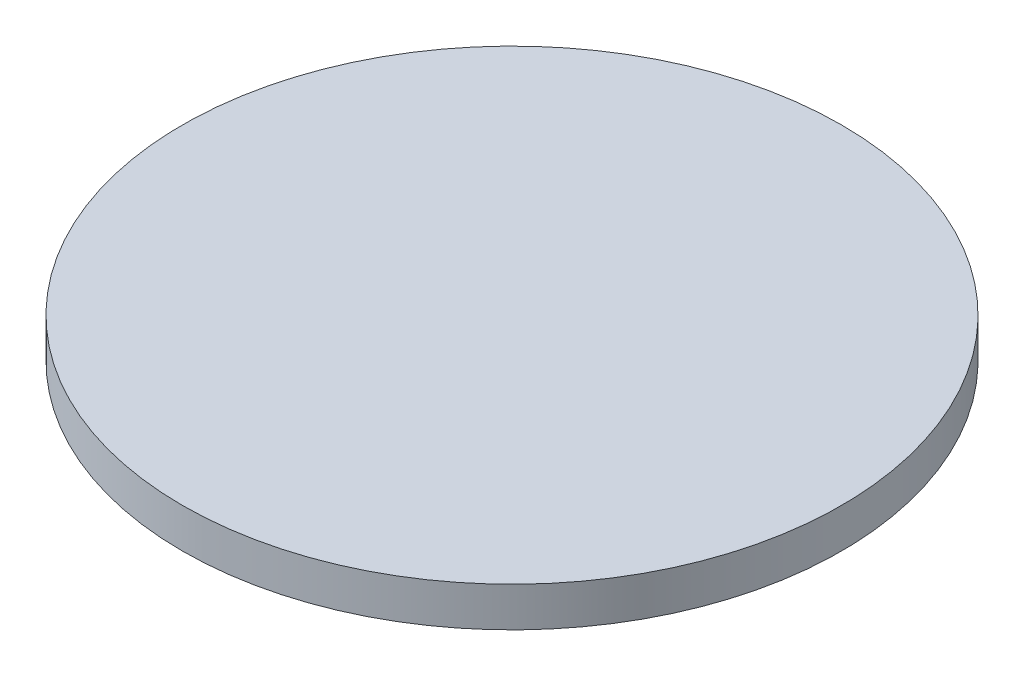
ISO-10303-21;
HEADER;
FILE_DESCRIPTION(('STEP AP214'),'2;1');
FILE_NAME('part.step','',(''),(''),'','','');
FILE_SCHEMA(('AUTOMOTIVE_DESIGN { 1 0 10303 214 1 1 1 1 }'));
ENDSEC;
DATA;
#1=APPLICATION_CONTEXT('core data for automotive mechanical design processes');
#2=APPLICATION_PROTOCOL_DEFINITION('international standard','automotive_design',2000,#1);
#3=PRODUCT_CONTEXT('',#1,'mechanical');
#4=PRODUCT('Part','Part','',(#3));
#5=PRODUCT_RELATED_PRODUCT_CATEGORY('part','',(#4));
#6=PRODUCT_DEFINITION_FORMATION('','',#4);
#7=PRODUCT_DEFINITION_CONTEXT('part definition',#1,'design');
#8=PRODUCT_DEFINITION('design','',#6,#7);
#9=PRODUCT_DEFINITION_SHAPE('','',#8);
#10=(LENGTH_UNIT() NAMED_UNIT(*) SI_UNIT(.MILLI.,.METRE.));
#11=(NAMED_UNIT(*) PLANE_ANGLE_UNIT() SI_UNIT($,.RADIAN.));
#12=(NAMED_UNIT(*) SI_UNIT($,.STERADIAN.) SOLID_ANGLE_UNIT());
#13=UNCERTAINTY_MEASURE_WITH_UNIT(LENGTH_MEASURE(1.E-05),#10,'distance_accuracy_value','');
#14=(GEOMETRIC_REPRESENTATION_CONTEXT(3) GLOBAL_UNCERTAINTY_ASSIGNED_CONTEXT((#13)) GLOBAL_UNIT_ASSIGNED_CONTEXT((#10,
#11,#12)) REPRESENTATION_CONTEXT('',''));
#15=CARTESIAN_POINT('',(0.,0.,0.));
#16=DIRECTION('',(0.,0.,1.));
#17=DIRECTION('',(1.,0.,0.));
#18=AXIS2_PLACEMENT_3D('',#15,#16,#17);
#19=CARTESIAN_POINT('',(0.,6.,0.));
#20=DIRECTION('',(0.,-1.,0.));
#21=DIRECTION('',(0.,0.,-1.));
#22=AXIS2_PLACEMENT_3D('',#19,#20,#21);
#23=CYLINDRICAL_SURFACE('',#22,50.);
#24=CARTESIAN_POINT('',(0.,6.,0.));
#25=DIRECTION('',(0.,1.,0.));
#26=DIRECTION('',(0.,0.,1.));
#27=AXIS2_PLACEMENT_3D('',#24,#25,#26);
#28=CIRCLE('',#27,50.);
#29=CARTESIAN_POINT('',(0.,6.,50.));
#30=VERTEX_POINT('',#29);
#31=EDGE_CURVE('E10',#30,#30,#28,.T.);
#32=ORIENTED_EDGE('',*,*,#31,.F.);
#33=EDGE_LOOP('',(#32));
#34=FACE_BOUND('',#33,.T.);
#35=CARTESIAN_POINT('',(0.,0.,0.));
#36=DIRECTION('',(0.,1.,0.));
#37=DIRECTION('',(0.,0.,1.));
#38=AXIS2_PLACEMENT_3D('',#35,#36,#37);
#39=CIRCLE('',#38,50.);
#40=CARTESIAN_POINT('',(0.,0.,50.));
#41=VERTEX_POINT('',#40);
#42=EDGE_CURVE('E38',#41,#41,#39,.T.);
#43=ORIENTED_EDGE('',*,*,#42,.T.);
#44=EDGE_LOOP('',(#43));
#45=FACE_BOUND('',#44,.T.);
#46=ADVANCED_FACE('F35',(#34,#45),#23,.T.);
#47=CARTESIAN_POINT('',(0.,6.,0.));
#48=DIRECTION('',(0.,1.,0.));
#49=DIRECTION('',(0.,0.,1.));
#50=AXIS2_PLACEMENT_3D('',#47,#48,#49);
#51=PLANE('',#50);
#52=ORIENTED_EDGE('',*,*,#31,.T.);
#53=EDGE_LOOP('',(#52));
#54=FACE_BOUND('',#53,.T.);
#55=ADVANCED_FACE('F50',(#54),#51,.T.);
#56=CARTESIAN_POINT('',(0.,0.,0.));
#57=DIRECTION('',(0.,1.,0.));
#58=DIRECTION('',(0.,0.,1.));
#59=AXIS2_PLACEMENT_3D('',#56,#57,#58);
#60=PLANE('',#59);
#61=ORIENTED_EDGE('',*,*,#42,.F.);
#62=EDGE_LOOP('',(#61));
#63=FACE_BOUND('',#62,.T.);
#64=ADVANCED_FACE('F48',(#63),#60,.F.);
#65=CLOSED_SHELL('',(#46,#55,#64));
#66=MANIFOLD_SOLID_BREP('B2',#65);
#67=ADVANCED_BREP_SHAPE_REPRESENTATION('',(#18,#66),#14);
#68=SHAPE_DEFINITION_REPRESENTATION(#9,#67);
ENDSEC;
END-ISO-10303-21;
